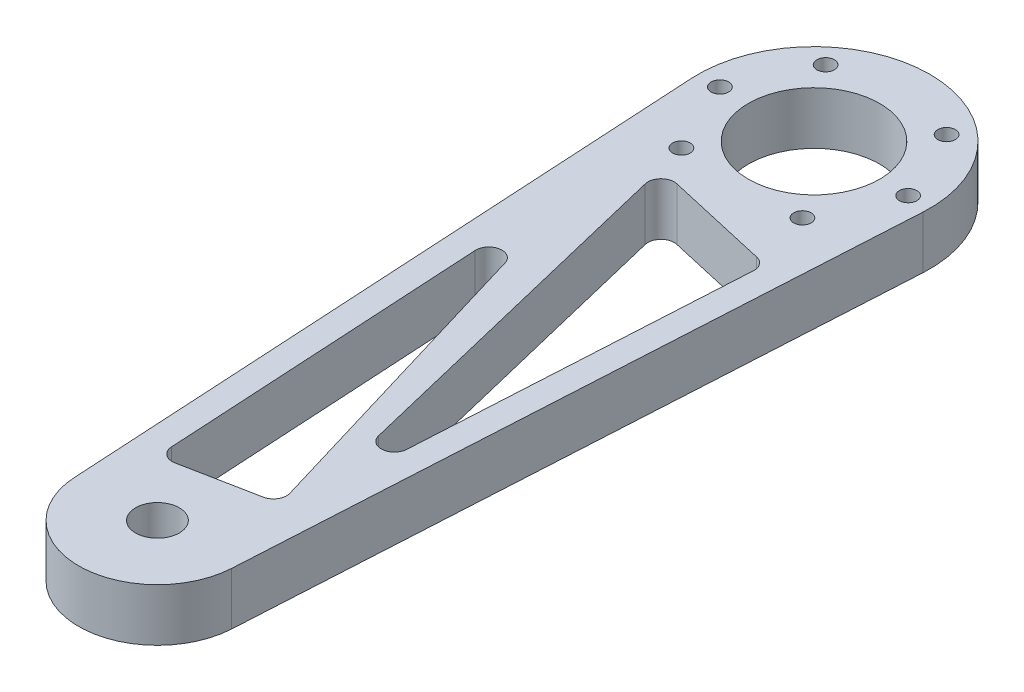
ISO-10303-21;
HEADER;
FILE_DESCRIPTION(('STEP AP214'),'2;1');
FILE_NAME('part.step','',(''),(''),'','','');
FILE_SCHEMA(('AUTOMOTIVE_DESIGN { 1 0 10303 214 1 1 1 1 }'));
ENDSEC;
DATA;
#1=APPLICATION_CONTEXT('core data for automotive mechanical design processes');
#2=APPLICATION_PROTOCOL_DEFINITION('international standard','automotive_design',2000,#1);
#3=PRODUCT_CONTEXT('',#1,'mechanical');
#4=PRODUCT('Part','Part','',(#3));
#5=PRODUCT_RELATED_PRODUCT_CATEGORY('part','',(#4));
#6=PRODUCT_DEFINITION_FORMATION('','',#4);
#7=PRODUCT_DEFINITION_CONTEXT('part definition',#1,'design');
#8=PRODUCT_DEFINITION('design','',#6,#7);
#9=PRODUCT_DEFINITION_SHAPE('','',#8);
#10=(LENGTH_UNIT() NAMED_UNIT(*) SI_UNIT(.MILLI.,.METRE.));
#11=(NAMED_UNIT(*) PLANE_ANGLE_UNIT() SI_UNIT($,.RADIAN.));
#12=(NAMED_UNIT(*) SI_UNIT($,.STERADIAN.) SOLID_ANGLE_UNIT());
#13=UNCERTAINTY_MEASURE_WITH_UNIT(LENGTH_MEASURE(1.E-05),#10,'distance_accuracy_value','');
#14=(GEOMETRIC_REPRESENTATION_CONTEXT(3) GLOBAL_UNCERTAINTY_ASSIGNED_CONTEXT((#13)) GLOBAL_UNIT_ASSIGNED_CONTEXT((#10,
#11,#12)) REPRESENTATION_CONTEXT('',''));
#15=CARTESIAN_POINT('',(0.,0.,0.));
#16=DIRECTION('',(0.,0.,1.));
#17=DIRECTION('',(1.,0.,0.));
#18=AXIS2_PLACEMENT_3D('',#15,#16,#17);
#19=CARTESIAN_POINT('',(0.,12.,0.));
#20=DIRECTION('',(0.,1.,0.));
#21=DIRECTION('',(0.,0.,1.));
#22=AXIS2_PLACEMENT_3D('',#19,#20,#21);
#23=PLANE('',#22);
#24=CARTESIAN_POINT('',(-13.8199336082606,12.,-166.469955527058));
#25=DIRECTION('',(0.,1.,0.));
#26=DIRECTION('',(-0.766044443118979,0.,0.642787609686538));
#27=AXIS2_PLACEMENT_3D('',#24,#25,#26);
#28=CIRCLE('',#27,2.);
#29=CARTESIAN_POINT('',(-15.3520224944985,12.,-165.184380307685));
#30=VERTEX_POINT('',#29);
#31=EDGE_CURVE('E372',#30,#30,#28,.T.);
#32=ORIENTED_EDGE('',*,*,#31,.F.);
#33=EDGE_LOOP('',(#32));
#34=FACE_BOUND('',#33,.T.);
#35=CARTESIAN_POINT('',(13.8199336082606,12.,-133.530044472942));
#36=DIRECTION('',(0.,1.,0.));
#37=DIRECTION('',(-0.766044443118979,0.,0.642787609686538));
#38=AXIS2_PLACEMENT_3D('',#35,#36,#37);
#39=CIRCLE('',#38,2.);
#40=CARTESIAN_POINT('',(12.2878447220226,12.,-132.244469253569));
#41=VERTEX_POINT('',#40);
#42=EDGE_CURVE('E378',#41,#41,#39,.T.);
#43=ORIENTED_EDGE('',*,*,#42,.F.);
#44=EDGE_LOOP('',(#43));
#45=FACE_BOUND('',#44,.T.);
#46=CARTESIAN_POINT('',(-13.8199336082606,12.,-133.530044472942));
#47=DIRECTION('',(0.,1.,0.));
#48=DIRECTION('',(0.766044443118979,0.,0.642787609686538));
#49=AXIS2_PLACEMENT_3D('',#46,#47,#48);
#50=CIRCLE('',#49,2.);
#51=CARTESIAN_POINT('',(-12.2878447220226,12.,-132.244469253569));
#52=VERTEX_POINT('',#51);
#53=EDGE_CURVE('E387',#52,#52,#50,.T.);
#54=ORIENTED_EDGE('',*,*,#53,.F.);
#55=EDGE_LOOP('',(#54));
#56=FACE_BOUND('',#55,.T.);
#57=CARTESIAN_POINT('',(13.8199336082606,12.,-166.469955527058));
#58=DIRECTION('',(0.,1.,0.));
#59=DIRECTION('',(0.766044443118979,0.,0.642787609686538));
#60=AXIS2_PLACEMENT_3D('',#57,#58,#59);
#61=CIRCLE('',#60,2.);
#62=CARTESIAN_POINT('',(15.3520224944985,12.,-165.184380307685));
#63=VERTEX_POINT('',#62);
#64=EDGE_CURVE('E375',#63,#63,#61,.T.);
#65=ORIENTED_EDGE('',*,*,#64,.F.);
#66=EDGE_LOOP('',(#65));
#67=FACE_BOUND('',#66,.T.);
#68=CARTESIAN_POINT('',(-21.5,12.,-150.));
#69=DIRECTION('',(0.,1.,0.));
#70=DIRECTION('',(0.,0.,1.));
#71=AXIS2_PLACEMENT_3D('',#68,#69,#70);
#72=CIRCLE('',#71,2.);
#73=CARTESIAN_POINT('',(-21.5,12.,-148.));
#74=VERTEX_POINT('',#73);
#75=EDGE_CURVE('E399',#74,#74,#72,.T.);
#76=ORIENTED_EDGE('',*,*,#75,.F.);
#77=EDGE_LOOP('',(#76));
#78=FACE_BOUND('',#77,.T.);
#79=CARTESIAN_POINT('',(21.5,12.,-150.));
#80=DIRECTION('',(0.,1.,0.));
#81=DIRECTION('',(0.,0.,1.));
#82=AXIS2_PLACEMENT_3D('',#79,#80,#81);
#83=CIRCLE('',#82,2.);
#84=CARTESIAN_POINT('',(21.5,12.,-148.));
#85=VERTEX_POINT('',#84);
#86=EDGE_CURVE('E386',#85,#85,#83,.T.);
#87=ORIENTED_EDGE('',*,*,#86,.F.);
#88=EDGE_LOOP('',(#87));
#89=FACE_BOUND('',#88,.T.);
#90=CARTESIAN_POINT('',(0.,12.,0.));
#91=DIRECTION('',(0.,1.,0.));
#92=DIRECTION('',(0.,0.,1.));
#93=AXIS2_PLACEMENT_3D('',#90,#91,#92);
#94=CIRCLE('',#93,5.);
#95=CARTESIAN_POINT('',(0.,12.,5.));
#96=VERTEX_POINT('',#95);
#97=EDGE_CURVE('E271',#96,#96,#94,.T.);
#98=ORIENTED_EDGE('',*,*,#97,.F.);
#99=EDGE_LOOP('',(#98));
#100=FACE_BOUND('',#99,.T.);
#101=CARTESIAN_POINT('',(0.,12.,0.));
#102=DIRECTION('',(0.,1.,0.));
#103=DIRECTION('',(0.,0.,1.));
#104=AXIS2_PLACEMENT_3D('',#101,#102,#103);
#105=CIRCLE('',#104,18.);
#106=CARTESIAN_POINT('',(-17.971076762398,12.,1.02));
#107=VERTEX_POINT('',#106);
#108=CARTESIAN_POINT('',(17.971076762398,12.,1.02));
#109=VERTEX_POINT('',#108);
#110=EDGE_CURVE('E163',#107,#109,#105,.T.);
#111=ORIENTED_EDGE('',*,*,#110,.T.);
#112=DIRECTION('',(0.0566666666666667,0.,-0.998393153466553));
#113=VECTOR('',#112,1.);
#114=CARTESIAN_POINT('',(17.971076762398,12.,1.02));
#115=LINE('',#114,#113);
#116=CARTESIAN_POINT('',(26.4574185668637,12.,-148.498333333333));
#117=VERTEX_POINT('',#116);
#118=EDGE_CURVE('E152',#109,#117,#115,.T.);
#119=ORIENTED_EDGE('',*,*,#118,.T.);
#120=CARTESIAN_POINT('',(0.,12.,-150.));
#121=DIRECTION('',(0.,1.,0.));
#122=DIRECTION('',(0.,0.,-1.));
#123=AXIS2_PLACEMENT_3D('',#120,#121,#122);
#124=CIRCLE('',#123,26.5);
#125=CARTESIAN_POINT('',(-26.4574185668637,12.,-148.498333333333));
#126=VERTEX_POINT('',#125);
#127=EDGE_CURVE('E162',#117,#126,#124,.T.);
#128=ORIENTED_EDGE('',*,*,#127,.T.);
#129=DIRECTION('',(0.0566666666666667,0.,0.998393153466553));
#130=VECTOR('',#129,1.);
#131=CARTESIAN_POINT('',(-17.971076762398,12.,1.02));
#132=LINE('',#131,#130);
#133=EDGE_CURVE('E168',#126,#107,#132,.T.);
#134=ORIENTED_EDGE('',*,*,#133,.T.);
#135=EDGE_LOOP('',(#111,#119,#128,#134));
#136=FACE_BOUND('',#135,.T.);
#137=CARTESIAN_POINT('',(0.,12.,-150.));
#138=DIRECTION('',(0.,1.,0.));
#139=DIRECTION('',(0.,0.,1.));
#140=AXIS2_PLACEMENT_3D('',#137,#138,#139);
#141=CIRCLE('',#140,15.);
#142=CARTESIAN_POINT('',(0.,12.,-135.));
#143=VERTEX_POINT('',#142);
#144=EDGE_CURVE('E265',#143,#143,#141,.T.);
#145=ORIENTED_EDGE('',*,*,#144,.F.);
#146=EDGE_LOOP('',(#145));
#147=FACE_BOUND('',#146,.T.);
#148=DIRECTION('',(-0.286666756449605,0.,-0.958030360033889));
#149=VECTOR('',#148,1.);
#150=CARTESIAN_POINT('',(-18.5543851913669,12.,-115.139490738387));
#151=LINE('',#150,#149);
#152=CARTESIAN_POINT('',(9.76560528215196,12.,-20.4950645568282));
#153=VERTEX_POINT('',#152);
#154=CARTESIAN_POINT('',(-11.2390630531947,12.,-90.6919378076061));
#155=VERTEX_POINT('',#154);
#156=EDGE_CURVE('E251',#153,#155,#151,.T.);
#157=ORIENTED_EDGE('',*,*,#156,.F.);
#158=CARTESIAN_POINT('',(6.8915142020503,12.,-19.6350642874794));
#159=DIRECTION('',(0.,1.,0.));
#160=DIRECTION('',(0.,0.,1.));
#161=AXIS2_PLACEMENT_3D('',#158,#159,#160);
#162=CIRCLE('',#161,3.);
#163=CARTESIAN_POINT('',(7.47066200637673,12.,-16.6914970943031));
#164=VERTEX_POINT('',#163);
#165=EDGE_CURVE('E11',#153,#164,#162,.F.);
#166=ORIENTED_EDGE('',*,*,#165,.T.);
#167=DIRECTION('',(0.981189064392104,0.,-0.19304926810881));
#168=VECTOR('',#167,1.);
#169=CARTESIAN_POINT('',(10.7128519545465,12.,-17.3293990229714));
#170=LINE('',#169,#168);
#171=CARTESIAN_POINT('',(-9.3618110753663,12.,-13.3797025311371));
#172=VERTEX_POINT('',#171);
#173=EDGE_CURVE('E249',#172,#164,#170,.T.);
#174=ORIENTED_EDGE('',*,*,#173,.F.);
#175=CARTESIAN_POINT('',(-9.94095887969273,12.,-16.3232697243134));
#176=DIRECTION('',(0.,1.,0.));
#177=DIRECTION('',(0.,0.,1.));
#178=AXIS2_PLACEMENT_3D('',#175,#176,#177);
#179=CIRCLE('',#178,3.);
#180=CARTESIAN_POINT('',(-12.9361383400924,12.,-16.1532697243134));
#181=VERTEX_POINT('',#180);
#182=EDGE_CURVE('E225',#172,#181,#179,.F.);
#183=ORIENTED_EDGE('',*,*,#182,.T.);
#184=DIRECTION('',(0.0566666666666666,0.,0.998393153466553));
#185=VECTOR('',#184,1.);
#186=CARTESIAN_POINT('',(-12.7409809539486,12.,-12.7148497565296));
#187=LINE('',#186,#185);
#188=CARTESIAN_POINT('',(-17.108333593696,12.,-89.6619375382572));
#189=VERTEX_POINT('',#188);
#190=EDGE_CURVE('E253',#189,#181,#187,.T.);
#191=ORIENTED_EDGE('',*,*,#190,.F.);
#192=CARTESIAN_POINT('',(-14.1131541332963,12.,-89.8319375382572));
#193=DIRECTION('',(0.,1.,0.));
#194=DIRECTION('',(0.,0.,1.));
#195=AXIS2_PLACEMENT_3D('',#192,#193,#194);
#196=CIRCLE('',#195,3.);
#197=EDGE_CURVE('E221',#189,#155,#196,.F.);
#198=ORIENTED_EDGE('',*,*,#197,.T.);
#199=EDGE_LOOP('',(#157,#166,#174,#183,#191,#198));
#200=FACE_BOUND('',#199,.T.);
#201=DIRECTION('',(0.234668209936248,0.,0.972075527541619));
#202=VECTOR('',#201,1.);
#203=CARTESIAN_POINT('',(-12.,12.,-127.));
#204=LINE('',#203,#202);
#205=CARTESIAN_POINT('',(-10.8653488920019,12.,-122.299889257763));
#206=VERTEX_POINT('',#205);
#207=CARTESIAN_POINT('',(8.52161939319862,12.,-41.992473829023));
#208=VERTEX_POINT('',#207);
#209=EDGE_CURVE('E410',#206,#208,#204,.T.);
#210=ORIENTED_EDGE('',*,*,#209,.F.);
#211=CARTESIAN_POINT('',(-7.94912230937701,12.,-123.003893887571));
#212=DIRECTION('',(0.,1.,0.));
#213=DIRECTION('',(0.,0.,1.));
#214=AXIS2_PLACEMENT_3D('',#211,#212,#213);
#215=CIRCLE('',#214,3.);
#216=CARTESIAN_POINT('',(-7.28487950298156,12.,-125.929433409463));
#217=VERTEX_POINT('',#216);
#218=EDGE_CURVE('E217',#206,#217,#215,.F.);
#219=ORIENTED_EDGE('',*,*,#218,.T.);
#220=DIRECTION('',(-0.975179840630658,0.,-0.221414268798477));
#221=VECTOR('',#220,1.);
#222=CARTESIAN_POINT('',(18.8302573337206,12.,-120.));
#223=LINE('',#222,#221);
#224=CARTESIAN_POINT('',(16.3555160897141,12.,-120.561889202563));
#225=VERTEX_POINT('',#224);
#226=EDGE_CURVE('E407',#225,#217,#223,.T.);
#227=ORIENTED_EDGE('',*,*,#226,.F.);
#228=CARTESIAN_POINT('',(15.6912732833187,12.,-117.636349680671));
#229=DIRECTION('',(0.,1.,0.));
#230=DIRECTION('',(0.,0.,1.));
#231=AXIS2_PLACEMENT_3D('',#228,#229,#230);
#232=CIRCLE('',#231,3.);
#233=CARTESIAN_POINT('',(18.6864527437183,12.,-117.466349680671));
#234=VERTEX_POINT('',#233);
#235=EDGE_CURVE('E213',#225,#234,#232,.F.);
#236=ORIENTED_EDGE('',*,*,#235,.T.);
#237=DIRECTION('',(0.0566666666666667,0.,-0.998393153466553));
#238=VECTOR('',#237,1.);
#239=CARTESIAN_POINT('',(13.2832157063432,12.,-22.2683226570439));
#240=LINE('',#239,#238);
#241=CARTESIAN_POINT('',(14.4330254362231,12.,-42.5264784588318));
#242=VERTEX_POINT('',#241);
#243=EDGE_CURVE('E263',#242,#234,#240,.T.);
#244=ORIENTED_EDGE('',*,*,#243,.F.);
#245=CARTESIAN_POINT('',(11.4378459758235,12.,-42.6964784588318));
#246=DIRECTION('',(0.,1.,0.));
#247=DIRECTION('',(0.,0.,1.));
#248=AXIS2_PLACEMENT_3D('',#245,#246,#247);
#249=CIRCLE('',#248,3.);
#250=EDGE_CURVE('E229',#242,#208,#249,.F.);
#251=ORIENTED_EDGE('',*,*,#250,.T.);
#252=EDGE_LOOP('',(#210,#219,#227,#236,#244,#251));
#253=FACE_BOUND('',#252,.T.);
#254=ADVANCED_FACE('F39',(#34,#45,#56,#67,#78,#89,#100,#136,#147,#200,#253),#23,.T.);
#255=CARTESIAN_POINT('',(0.,0.,0.));
#256=DIRECTION('',(0.,1.,0.));
#257=DIRECTION('',(0.,0.,1.));
#258=AXIS2_PLACEMENT_3D('',#255,#256,#257);
#259=PLANE('',#258);
#260=CARTESIAN_POINT('',(-13.8199336082606,0.,-166.469955527058));
#261=DIRECTION('',(0.,1.,0.));
#262=DIRECTION('',(-0.766044443118979,0.,0.642787609686538));
#263=AXIS2_PLACEMENT_3D('',#260,#261,#262);
#264=CIRCLE('',#263,2.);
#265=CARTESIAN_POINT('',(-15.3520224944985,0.,-165.184380307685));
#266=VERTEX_POINT('',#265);
#267=EDGE_CURVE('E370',#266,#266,#264,.T.);
#268=ORIENTED_EDGE('',*,*,#267,.T.);
#269=EDGE_LOOP('',(#268));
#270=FACE_BOUND('',#269,.T.);
#271=CARTESIAN_POINT('',(13.8199336082606,0.,-133.530044472942));
#272=DIRECTION('',(0.,1.,0.));
#273=DIRECTION('',(-0.766044443118979,0.,0.642787609686538));
#274=AXIS2_PLACEMENT_3D('',#271,#272,#273);
#275=CIRCLE('',#274,2.);
#276=CARTESIAN_POINT('',(12.2878447220226,0.,-132.244469253569));
#277=VERTEX_POINT('',#276);
#278=EDGE_CURVE('E373',#277,#277,#275,.T.);
#279=ORIENTED_EDGE('',*,*,#278,.T.);
#280=EDGE_LOOP('',(#279));
#281=FACE_BOUND('',#280,.T.);
#282=CARTESIAN_POINT('',(-13.8199336082606,0.,-133.530044472942));
#283=DIRECTION('',(0.,1.,0.));
#284=DIRECTION('',(0.766044443118979,0.,0.642787609686538));
#285=AXIS2_PLACEMENT_3D('',#282,#283,#284);
#286=CIRCLE('',#285,2.);
#287=CARTESIAN_POINT('',(-12.2878447220226,0.,-132.244469253569));
#288=VERTEX_POINT('',#287);
#289=EDGE_CURVE('E383',#288,#288,#286,.T.);
#290=ORIENTED_EDGE('',*,*,#289,.T.);
#291=EDGE_LOOP('',(#290));
#292=FACE_BOUND('',#291,.T.);
#293=CARTESIAN_POINT('',(13.8199336082606,0.,-166.469955527058));
#294=DIRECTION('',(0.,1.,0.));
#295=DIRECTION('',(0.766044443118979,0.,0.642787609686538));
#296=AXIS2_PLACEMENT_3D('',#293,#294,#295);
#297=CIRCLE('',#296,2.);
#298=CARTESIAN_POINT('',(15.3520224944985,0.,-165.184380307685));
#299=VERTEX_POINT('',#298);
#300=EDGE_CURVE('E390',#299,#299,#297,.T.);
#301=ORIENTED_EDGE('',*,*,#300,.T.);
#302=EDGE_LOOP('',(#301));
#303=FACE_BOUND('',#302,.T.);
#304=CARTESIAN_POINT('',(-21.5,0.,-150.));
#305=DIRECTION('',(0.,1.,0.));
#306=DIRECTION('',(0.,0.,1.));
#307=AXIS2_PLACEMENT_3D('',#304,#305,#306);
#308=CIRCLE('',#307,2.);
#309=CARTESIAN_POINT('',(-21.5,0.,-148.));
#310=VERTEX_POINT('',#309);
#311=EDGE_CURVE('E395',#310,#310,#308,.T.);
#312=ORIENTED_EDGE('',*,*,#311,.T.);
#313=EDGE_LOOP('',(#312));
#314=FACE_BOUND('',#313,.T.);
#315=CARTESIAN_POINT('',(21.5,0.,-150.));
#316=DIRECTION('',(0.,1.,0.));
#317=DIRECTION('',(0.,0.,1.));
#318=AXIS2_PLACEMENT_3D('',#315,#316,#317);
#319=CIRCLE('',#318,2.);
#320=CARTESIAN_POINT('',(21.5,0.,-148.));
#321=VERTEX_POINT('',#320);
#322=EDGE_CURVE('E402',#321,#321,#319,.T.);
#323=ORIENTED_EDGE('',*,*,#322,.T.);
#324=EDGE_LOOP('',(#323));
#325=FACE_BOUND('',#324,.T.);
#326=DIRECTION('',(0.0566666666666666,0.,0.998393153466553));
#327=VECTOR('',#326,1.);
#328=CARTESIAN_POINT('',(-12.7409809539486,0.,-12.7148497565296));
#329=LINE('',#328,#327);
#330=CARTESIAN_POINT('',(-17.108333593696,0.,-89.6619375382572));
#331=VERTEX_POINT('',#330);
#332=CARTESIAN_POINT('',(-12.9361383400924,0.,-16.1532697243134));
#333=VERTEX_POINT('',#332);
#334=EDGE_CURVE('E246',#331,#333,#329,.T.);
#335=ORIENTED_EDGE('',*,*,#334,.T.);
#336=CARTESIAN_POINT('',(-9.94095887969273,0.,-16.3232697243134));
#337=DIRECTION('',(0.,1.,0.));
#338=DIRECTION('',(0.,0.,1.));
#339=AXIS2_PLACEMENT_3D('',#336,#337,#338);
#340=CIRCLE('',#339,3.);
#341=CARTESIAN_POINT('',(-9.3618110753663,0.,-13.3797025311371));
#342=VERTEX_POINT('',#341);
#343=EDGE_CURVE('E223',#333,#342,#340,.T.);
#344=ORIENTED_EDGE('',*,*,#343,.T.);
#345=DIRECTION('',(0.981189064392104,0.,-0.19304926810881));
#346=VECTOR('',#345,1.);
#347=CARTESIAN_POINT('',(10.7128519545465,0.,-17.3293990229714));
#348=LINE('',#347,#346);
#349=CARTESIAN_POINT('',(7.47066200637673,0.,-16.6914970943031));
#350=VERTEX_POINT('',#349);
#351=EDGE_CURVE('E238',#342,#350,#348,.T.);
#352=ORIENTED_EDGE('',*,*,#351,.T.);
#353=CARTESIAN_POINT('',(6.8915142020503,0.,-19.6350642874794));
#354=DIRECTION('',(0.,1.,0.));
#355=DIRECTION('',(0.,0.,1.));
#356=AXIS2_PLACEMENT_3D('',#353,#354,#355);
#357=CIRCLE('',#356,3.);
#358=CARTESIAN_POINT('',(9.76560528215196,0.,-20.4950645568282));
#359=VERTEX_POINT('',#358);
#360=EDGE_CURVE('E47',#350,#359,#357,.T.);
#361=ORIENTED_EDGE('',*,*,#360,.T.);
#362=DIRECTION('',(-0.286666756449605,0.,-0.958030360033889));
#363=VECTOR('',#362,1.);
#364=CARTESIAN_POINT('',(-18.5543851913669,0.,-115.139490738387));
#365=LINE('',#364,#363);
#366=CARTESIAN_POINT('',(-11.2390630531947,0.,-90.6919378076061));
#367=VERTEX_POINT('',#366);
#368=EDGE_CURVE('E237',#359,#367,#365,.T.);
#369=ORIENTED_EDGE('',*,*,#368,.T.);
#370=CARTESIAN_POINT('',(-14.1131541332963,0.,-89.8319375382572));
#371=DIRECTION('',(0.,1.,0.));
#372=DIRECTION('',(0.,0.,1.));
#373=AXIS2_PLACEMENT_3D('',#370,#371,#372);
#374=CIRCLE('',#373,3.);
#375=EDGE_CURVE('E219',#367,#331,#374,.T.);
#376=ORIENTED_EDGE('',*,*,#375,.T.);
#377=EDGE_LOOP('',(#335,#344,#352,#361,#369,#376));
#378=FACE_BOUND('',#377,.T.);
#379=CARTESIAN_POINT('',(0.,0.,0.));
#380=DIRECTION('',(0.,1.,0.));
#381=DIRECTION('',(0.,0.,1.));
#382=AXIS2_PLACEMENT_3D('',#379,#380,#381);
#383=CIRCLE('',#382,18.);
#384=CARTESIAN_POINT('',(-17.971076762398,0.,1.02));
#385=VERTEX_POINT('',#384);
#386=CARTESIAN_POINT('',(17.971076762398,0.,1.02));
#387=VERTEX_POINT('',#386);
#388=EDGE_CURVE('E176',#385,#387,#383,.T.);
#389=ORIENTED_EDGE('',*,*,#388,.F.);
#390=DIRECTION('',(0.0566666666666667,0.,0.998393153466553));
#391=VECTOR('',#390,1.);
#392=CARTESIAN_POINT('',(-17.971076762398,0.,1.02));
#393=LINE('',#392,#391);
#394=CARTESIAN_POINT('',(-26.4574185668637,0.,-148.498333333333));
#395=VERTEX_POINT('',#394);
#396=EDGE_CURVE('E172',#395,#385,#393,.T.);
#397=ORIENTED_EDGE('',*,*,#396,.F.);
#398=CARTESIAN_POINT('',(0.,0.,-150.));
#399=DIRECTION('',(0.,1.,0.));
#400=DIRECTION('',(0.,0.,-1.));
#401=AXIS2_PLACEMENT_3D('',#398,#399,#400);
#402=CIRCLE('',#401,26.5);
#403=CARTESIAN_POINT('',(26.4574185668637,0.,-148.498333333333));
#404=VERTEX_POINT('',#403);
#405=EDGE_CURVE('E282',#404,#395,#402,.T.);
#406=ORIENTED_EDGE('',*,*,#405,.F.);
#407=DIRECTION('',(0.0566666666666667,0.,-0.998393153466553));
#408=VECTOR('',#407,1.);
#409=CARTESIAN_POINT('',(17.971076762398,0.,1.02));
#410=LINE('',#409,#408);
#411=EDGE_CURVE('E280',#387,#404,#410,.T.);
#412=ORIENTED_EDGE('',*,*,#411,.F.);
#413=EDGE_LOOP('',(#389,#397,#406,#412));
#414=FACE_BOUND('',#413,.T.);
#415=CARTESIAN_POINT('',(0.,0.,0.));
#416=DIRECTION('',(0.,1.,0.));
#417=DIRECTION('',(0.,0.,1.));
#418=AXIS2_PLACEMENT_3D('',#415,#416,#417);
#419=CIRCLE('',#418,5.);
#420=CARTESIAN_POINT('',(0.,0.,5.));
#421=VERTEX_POINT('',#420);
#422=EDGE_CURVE('E268',#421,#421,#419,.T.);
#423=ORIENTED_EDGE('',*,*,#422,.T.);
#424=EDGE_LOOP('',(#423));
#425=FACE_BOUND('',#424,.T.);
#426=CARTESIAN_POINT('',(0.,0.,-150.));
#427=DIRECTION('',(0.,1.,0.));
#428=DIRECTION('',(0.,0.,1.));
#429=AXIS2_PLACEMENT_3D('',#426,#427,#428);
#430=CIRCLE('',#429,15.);
#431=CARTESIAN_POINT('',(0.,0.,-135.));
#432=VERTEX_POINT('',#431);
#433=EDGE_CURVE('E262',#432,#432,#430,.T.);
#434=ORIENTED_EDGE('',*,*,#433,.T.);
#435=EDGE_LOOP('',(#434));
#436=FACE_BOUND('',#435,.T.);
#437=DIRECTION('',(0.0566666666666667,0.,-0.998393153466553));
#438=VECTOR('',#437,1.);
#439=CARTESIAN_POINT('',(13.2832157063432,0.,-22.2683226570439));
#440=LINE('',#439,#438);
#441=CARTESIAN_POINT('',(14.4330254362231,0.,-42.5264784588318));
#442=VERTEX_POINT('',#441);
#443=CARTESIAN_POINT('',(18.6864527437183,0.,-117.466349680671));
#444=VERTEX_POINT('',#443);
#445=EDGE_CURVE('E257',#442,#444,#440,.T.);
#446=ORIENTED_EDGE('',*,*,#445,.T.);
#447=CARTESIAN_POINT('',(15.6912732833187,0.,-117.636349680671));
#448=DIRECTION('',(0.,1.,0.));
#449=DIRECTION('',(0.,0.,1.));
#450=AXIS2_PLACEMENT_3D('',#447,#448,#449);
#451=CIRCLE('',#450,3.);
#452=CARTESIAN_POINT('',(16.3555160897141,0.,-120.561889202563));
#453=VERTEX_POINT('',#452);
#454=EDGE_CURVE('E211',#444,#453,#451,.T.);
#455=ORIENTED_EDGE('',*,*,#454,.T.);
#456=DIRECTION('',(-0.975179840630658,0.,-0.221414268798477));
#457=VECTOR('',#456,1.);
#458=CARTESIAN_POINT('',(18.8302573337206,0.,-120.));
#459=LINE('',#458,#457);
#460=CARTESIAN_POINT('',(-7.28487950298156,0.,-125.929433409463));
#461=VERTEX_POINT('',#460);
#462=EDGE_CURVE('E398',#453,#461,#459,.T.);
#463=ORIENTED_EDGE('',*,*,#462,.T.);
#464=CARTESIAN_POINT('',(-7.94912230937701,0.,-123.003893887571));
#465=DIRECTION('',(0.,1.,0.));
#466=DIRECTION('',(0.,0.,1.));
#467=AXIS2_PLACEMENT_3D('',#464,#465,#466);
#468=CIRCLE('',#467,3.);
#469=CARTESIAN_POINT('',(-10.8653488920019,0.,-122.299889257763));
#470=VERTEX_POINT('',#469);
#471=EDGE_CURVE('E215',#461,#470,#468,.T.);
#472=ORIENTED_EDGE('',*,*,#471,.T.);
#473=DIRECTION('',(0.234668209936248,0.,0.972075527541619));
#474=VECTOR('',#473,1.);
#475=CARTESIAN_POINT('',(-12.,0.,-127.));
#476=LINE('',#475,#474);
#477=CARTESIAN_POINT('',(8.52161939319862,0.,-41.992473829023));
#478=VERTEX_POINT('',#477);
#479=EDGE_CURVE('E416',#470,#478,#476,.T.);
#480=ORIENTED_EDGE('',*,*,#479,.T.);
#481=CARTESIAN_POINT('',(11.4378459758235,0.,-42.6964784588318));
#482=DIRECTION('',(0.,1.,0.));
#483=DIRECTION('',(0.,0.,1.));
#484=AXIS2_PLACEMENT_3D('',#481,#482,#483);
#485=CIRCLE('',#484,3.);
#486=EDGE_CURVE('E227',#478,#442,#485,.T.);
#487=ORIENTED_EDGE('',*,*,#486,.T.);
#488=EDGE_LOOP('',(#446,#455,#463,#472,#480,#487));
#489=FACE_BOUND('',#488,.T.);
#490=ADVANCED_FACE('F235',(#270,#281,#292,#303,#314,#325,#378,#414,#425,#436,#489),#259,.F.);
#491=CARTESIAN_POINT('',(0.,12.,0.));
#492=DIRECTION('',(0.,-1.,0.));
#493=DIRECTION('',(0.,0.,-1.));
#494=AXIS2_PLACEMENT_3D('',#491,#492,#493);
#495=CYLINDRICAL_SURFACE('',#494,18.);
#496=ORIENTED_EDGE('',*,*,#388,.T.);
#497=DIRECTION('',(0.,-1.,0.));
#498=VECTOR('',#497,1.);
#499=CARTESIAN_POINT('',(17.971076762398,12.,1.02));
#500=LINE('',#499,#498);
#501=EDGE_CURVE('E156',#109,#387,#500,.T.);
#502=ORIENTED_EDGE('',*,*,#501,.F.);
#503=ORIENTED_EDGE('',*,*,#110,.F.);
#504=DIRECTION('',(0.,-1.,0.));
#505=VECTOR('',#504,1.);
#506=CARTESIAN_POINT('',(-17.971076762398,12.,1.02));
#507=LINE('',#506,#505);
#508=EDGE_CURVE('E278',#107,#385,#507,.T.);
#509=ORIENTED_EDGE('',*,*,#508,.T.);
#510=EDGE_LOOP('',(#496,#502,#503,#509));
#511=FACE_BOUND('',#510,.T.);
#512=ADVANCED_FACE('F174',(#511),#495,.T.);
#513=CARTESIAN_POINT('',(17.971076762398,12.,1.02));
#514=DIRECTION('',(-0.998393153466553,0.,-0.0566666666666667));
#515=DIRECTION('',(-0.0566666666666667,0.,0.998393153466553));
#516=AXIS2_PLACEMENT_3D('',#513,#514,#515);
#517=PLANE('',#516);
#518=ORIENTED_EDGE('',*,*,#411,.T.);
#519=DIRECTION('',(0.,-1.,0.));
#520=VECTOR('',#519,1.);
#521=CARTESIAN_POINT('',(26.4574185668637,12.,-148.498333333333));
#522=LINE('',#521,#520);
#523=EDGE_CURVE('E159',#117,#404,#522,.T.);
#524=ORIENTED_EDGE('',*,*,#523,.F.);
#525=ORIENTED_EDGE('',*,*,#118,.F.);
#526=ORIENTED_EDGE('',*,*,#501,.T.);
#527=EDGE_LOOP('',(#518,#524,#525,#526));
#528=FACE_BOUND('',#527,.T.);
#529=ADVANCED_FACE('F154',(#528),#517,.F.);
#530=CARTESIAN_POINT('',(0.,12.,-150.));
#531=DIRECTION('',(0.,-1.,0.));
#532=DIRECTION('',(0.,0.,-1.));
#533=AXIS2_PLACEMENT_3D('',#530,#531,#532);
#534=CYLINDRICAL_SURFACE('',#533,26.5);
#535=ORIENTED_EDGE('',*,*,#405,.T.);
#536=DIRECTION('',(0.,-1.,0.));
#537=VECTOR('',#536,1.);
#538=CARTESIAN_POINT('',(-26.4574185668637,12.,-148.498333333333));
#539=LINE('',#538,#537);
#540=EDGE_CURVE('E181',#126,#395,#539,.T.);
#541=ORIENTED_EDGE('',*,*,#540,.F.);
#542=ORIENTED_EDGE('',*,*,#127,.F.);
#543=ORIENTED_EDGE('',*,*,#523,.T.);
#544=EDGE_LOOP('',(#535,#541,#542,#543));
#545=FACE_BOUND('',#544,.T.);
#546=ADVANCED_FACE('F293',(#545),#534,.T.);
#547=CARTESIAN_POINT('',(-17.971076762398,12.,1.02));
#548=DIRECTION('',(0.998393153466553,0.,-0.0566666666666667));
#549=DIRECTION('',(-0.0566666666666667,0.,-0.998393153466553));
#550=AXIS2_PLACEMENT_3D('',#547,#548,#549);
#551=PLANE('',#550);
#552=ORIENTED_EDGE('',*,*,#396,.T.);
#553=ORIENTED_EDGE('',*,*,#508,.F.);
#554=ORIENTED_EDGE('',*,*,#133,.F.);
#555=ORIENTED_EDGE('',*,*,#540,.T.);
#556=EDGE_LOOP('',(#552,#553,#554,#555));
#557=FACE_BOUND('',#556,.T.);
#558=ADVANCED_FACE('F289',(#557),#551,.F.);
#559=CARTESIAN_POINT('',(0.,12.,0.));
#560=DIRECTION('',(0.,-1.,0.));
#561=DIRECTION('',(0.,0.,-1.));
#562=AXIS2_PLACEMENT_3D('',#559,#560,#561);
#563=CYLINDRICAL_SURFACE('',#562,5.);
#564=ORIENTED_EDGE('',*,*,#97,.T.);
#565=EDGE_LOOP('',(#564));
#566=FACE_BOUND('',#565,.T.);
#567=ORIENTED_EDGE('',*,*,#422,.F.);
#568=EDGE_LOOP('',(#567));
#569=FACE_BOUND('',#568,.T.);
#570=ADVANCED_FACE('F300',(#566,#569),#563,.F.);
#571=CARTESIAN_POINT('',(0.,12.,-150.));
#572=DIRECTION('',(0.,-1.,0.));
#573=DIRECTION('',(0.,0.,-1.));
#574=AXIS2_PLACEMENT_3D('',#571,#572,#573);
#575=CYLINDRICAL_SURFACE('',#574,15.);
#576=ORIENTED_EDGE('',*,*,#144,.T.);
#577=EDGE_LOOP('',(#576));
#578=FACE_BOUND('',#577,.T.);
#579=ORIENTED_EDGE('',*,*,#433,.F.);
#580=EDGE_LOOP('',(#579));
#581=FACE_BOUND('',#580,.T.);
#582=ADVANCED_FACE('F316',(#578,#581),#575,.F.);
#583=CARTESIAN_POINT('',(10.7128519545465,12.,-17.3293990229714));
#584=DIRECTION('',(-0.19304926810881,0.,-0.981189064392104));
#585=DIRECTION('',(-0.981189064392104,0.,0.19304926810881));
#586=AXIS2_PLACEMENT_3D('',#583,#584,#585);
#587=PLANE('',#586);
#588=ORIENTED_EDGE('',*,*,#351,.F.);
#589=DIRECTION('',(0.,-1.,0.));
#590=VECTOR('',#589,1.);
#591=CARTESIAN_POINT('',(-9.3618110753663,12.,-13.3797025311371));
#592=LINE('',#591,#590);
#593=EDGE_CURVE('E59',#342,#172,#592,.F.);
#594=ORIENTED_EDGE('',*,*,#593,.T.);
#595=ORIENTED_EDGE('',*,*,#173,.T.);
#596=DIRECTION('',(0.,-1.,0.));
#597=VECTOR('',#596,1.);
#598=CARTESIAN_POINT('',(7.47066200637673,0.,-16.6914970943031));
#599=LINE('',#598,#597);
#600=EDGE_CURVE('E207',#164,#350,#599,.T.);
#601=ORIENTED_EDGE('',*,*,#600,.T.);
#602=EDGE_LOOP('',(#588,#594,#595,#601));
#603=FACE_BOUND('',#602,.T.);
#604=ADVANCED_FACE('F248',(#603),#587,.T.);
#605=CARTESIAN_POINT('',(-18.5543851913669,12.,-115.139490738387));
#606=DIRECTION('',(-0.958030360033889,0.,0.286666756449605));
#607=DIRECTION('',(0.286666756449605,0.,0.958030360033889));
#608=AXIS2_PLACEMENT_3D('',#605,#606,#607);
#609=PLANE('',#608);
#610=ORIENTED_EDGE('',*,*,#156,.T.);
#611=DIRECTION('',(0.,-1.,0.));
#612=VECTOR('',#611,1.);
#613=CARTESIAN_POINT('',(-11.2390630531947,0.,-90.6919378076061));
#614=LINE('',#613,#612);
#615=EDGE_CURVE('E199',#155,#367,#614,.T.);
#616=ORIENTED_EDGE('',*,*,#615,.T.);
#617=ORIENTED_EDGE('',*,*,#368,.F.);
#618=DIRECTION('',(0.,-1.,0.));
#619=VECTOR('',#618,1.);
#620=CARTESIAN_POINT('',(9.76560528215196,12.,-20.4950645568282));
#621=LINE('',#620,#619);
#622=EDGE_CURVE('E197',#359,#153,#621,.F.);
#623=ORIENTED_EDGE('',*,*,#622,.T.);
#624=EDGE_LOOP('',(#610,#616,#617,#623));
#625=FACE_BOUND('',#624,.T.);
#626=ADVANCED_FACE('F244',(#625),#609,.T.);
#627=CARTESIAN_POINT('',(-12.7409809539486,12.,-12.7148497565296));
#628=DIRECTION('',(0.998393153466553,0.,-0.0566666666666666));
#629=DIRECTION('',(-0.0566666666666666,0.,-0.998393153466553));
#630=AXIS2_PLACEMENT_3D('',#627,#628,#629);
#631=PLANE('',#630);
#632=ORIENTED_EDGE('',*,*,#334,.F.);
#633=DIRECTION('',(0.,-1.,0.));
#634=VECTOR('',#633,1.);
#635=CARTESIAN_POINT('',(-17.108333593696,12.,-89.6619375382572));
#636=LINE('',#635,#634);
#637=EDGE_CURVE('E205',#331,#189,#636,.F.);
#638=ORIENTED_EDGE('',*,*,#637,.T.);
#639=ORIENTED_EDGE('',*,*,#190,.T.);
#640=DIRECTION('',(0.,-1.,0.));
#641=VECTOR('',#640,1.);
#642=CARTESIAN_POINT('',(-12.9361383400924,0.,-16.1532697243134));
#643=LINE('',#642,#641);
#644=EDGE_CURVE('E202',#181,#333,#643,.T.);
#645=ORIENTED_EDGE('',*,*,#644,.T.);
#646=EDGE_LOOP('',(#632,#638,#639,#645));
#647=FACE_BOUND('',#646,.T.);
#648=ADVANCED_FACE('F325',(#647),#631,.T.);
#649=CARTESIAN_POINT('',(18.8302573337206,12.,-120.));
#650=DIRECTION('',(-0.221414268798477,0.,0.975179840630658));
#651=DIRECTION('',(0.975179840630658,0.,0.221414268798477));
#652=AXIS2_PLACEMENT_3D('',#649,#650,#651);
#653=PLANE('',#652);
#654=ORIENTED_EDGE('',*,*,#462,.F.);
#655=DIRECTION('',(0.,-1.,0.));
#656=VECTOR('',#655,1.);
#657=CARTESIAN_POINT('',(16.3555160897141,12.,-120.561889202563));
#658=LINE('',#657,#656);
#659=EDGE_CURVE('E190',#453,#225,#658,.F.);
#660=ORIENTED_EDGE('',*,*,#659,.T.);
#661=ORIENTED_EDGE('',*,*,#226,.T.);
#662=DIRECTION('',(0.,-1.,0.));
#663=VECTOR('',#662,1.);
#664=CARTESIAN_POINT('',(-7.28487950298158,0.,-125.929433409463));
#665=LINE('',#664,#663);
#666=EDGE_CURVE('E187',#217,#461,#665,.T.);
#667=ORIENTED_EDGE('',*,*,#666,.T.);
#668=EDGE_LOOP('',(#654,#660,#661,#667));
#669=FACE_BOUND('',#668,.T.);
#670=ADVANCED_FACE('F328',(#669),#653,.T.);
#671=CARTESIAN_POINT('',(-12.,12.,-127.));
#672=DIRECTION('',(0.972075527541619,0.,-0.234668209936248));
#673=DIRECTION('',(-0.234668209936248,0.,-0.972075527541619));
#674=AXIS2_PLACEMENT_3D('',#671,#672,#673);
#675=PLANE('',#674);
#676=ORIENTED_EDGE('',*,*,#479,.F.);
#677=DIRECTION('',(0.,-1.,0.));
#678=VECTOR('',#677,1.);
#679=CARTESIAN_POINT('',(-10.8653488920019,12.,-122.299889257763));
#680=LINE('',#679,#678);
#681=EDGE_CURVE('E195',#470,#206,#680,.F.);
#682=ORIENTED_EDGE('',*,*,#681,.T.);
#683=ORIENTED_EDGE('',*,*,#209,.T.);
#684=DIRECTION('',(0.,-1.,0.));
#685=VECTOR('',#684,1.);
#686=CARTESIAN_POINT('',(8.52161939319862,0.,-41.9924738290231));
#687=LINE('',#686,#685);
#688=EDGE_CURVE('E192',#208,#478,#687,.T.);
#689=ORIENTED_EDGE('',*,*,#688,.T.);
#690=EDGE_LOOP('',(#676,#682,#683,#689));
#691=FACE_BOUND('',#690,.T.);
#692=ADVANCED_FACE('F332',(#691),#675,.T.);
#693=CARTESIAN_POINT('',(13.2832157063432,12.,-22.2683226570439));
#694=DIRECTION('',(-0.998393153466553,0.,-0.0566666666666667));
#695=DIRECTION('',(-0.0566666666666667,0.,0.998393153466553));
#696=AXIS2_PLACEMENT_3D('',#693,#694,#695);
#697=PLANE('',#696);
#698=ORIENTED_EDGE('',*,*,#243,.T.);
#699=DIRECTION('',(0.,-1.,0.));
#700=VECTOR('',#699,1.);
#701=CARTESIAN_POINT('',(18.6864527437183,0.,-117.466349680671));
#702=LINE('',#701,#700);
#703=EDGE_CURVE('E179',#234,#444,#702,.T.);
#704=ORIENTED_EDGE('',*,*,#703,.T.);
#705=ORIENTED_EDGE('',*,*,#445,.F.);
#706=DIRECTION('',(0.,-1.,0.));
#707=VECTOR('',#706,1.);
#708=CARTESIAN_POINT('',(14.4330254362231,12.,-42.5264784588318));
#709=LINE('',#708,#707);
#710=EDGE_CURVE('E177',#442,#242,#709,.F.);
#711=ORIENTED_EDGE('',*,*,#710,.T.);
#712=EDGE_LOOP('',(#698,#704,#705,#711));
#713=FACE_BOUND('',#712,.T.);
#714=ADVANCED_FACE('F336',(#713),#697,.T.);
#715=CARTESIAN_POINT('',(15.6912732833187,12.,-117.636349680671));
#716=DIRECTION('',(0.,1.,0.));
#717=DIRECTION('',(0.,0.,1.));
#718=AXIS2_PLACEMENT_3D('',#715,#716,#717);
#719=CYLINDRICAL_SURFACE('',#718,3.);
#720=ORIENTED_EDGE('',*,*,#235,.F.);
#721=ORIENTED_EDGE('',*,*,#659,.F.);
#722=ORIENTED_EDGE('',*,*,#454,.F.);
#723=ORIENTED_EDGE('',*,*,#703,.F.);
#724=EDGE_LOOP('',(#720,#721,#722,#723));
#725=FACE_BOUND('',#724,.T.);
#726=ADVANCED_FACE('F340',(#725),#719,.F.);
#727=CARTESIAN_POINT('',(-7.94912230937701,12.,-123.003893887571));
#728=DIRECTION('',(0.,1.,0.));
#729=DIRECTION('',(0.,0.,1.));
#730=AXIS2_PLACEMENT_3D('',#727,#728,#729);
#731=CYLINDRICAL_SURFACE('',#730,3.);
#732=ORIENTED_EDGE('',*,*,#218,.F.);
#733=ORIENTED_EDGE('',*,*,#681,.F.);
#734=ORIENTED_EDGE('',*,*,#471,.F.);
#735=ORIENTED_EDGE('',*,*,#666,.F.);
#736=EDGE_LOOP('',(#732,#733,#734,#735));
#737=FACE_BOUND('',#736,.T.);
#738=ADVANCED_FACE('F435',(#737),#731,.F.);
#739=CARTESIAN_POINT('',(-14.1131541332963,12.,-89.8319375382572));
#740=DIRECTION('',(0.,1.,0.));
#741=DIRECTION('',(0.,0.,1.));
#742=AXIS2_PLACEMENT_3D('',#739,#740,#741);
#743=CYLINDRICAL_SURFACE('',#742,3.);
#744=ORIENTED_EDGE('',*,*,#197,.F.);
#745=ORIENTED_EDGE('',*,*,#637,.F.);
#746=ORIENTED_EDGE('',*,*,#375,.F.);
#747=ORIENTED_EDGE('',*,*,#615,.F.);
#748=EDGE_LOOP('',(#744,#745,#746,#747));
#749=FACE_BOUND('',#748,.T.);
#750=ADVANCED_FACE('F446',(#749),#743,.F.);
#751=CARTESIAN_POINT('',(-9.94095887969273,12.,-16.3232697243134));
#752=DIRECTION('',(0.,1.,0.));
#753=DIRECTION('',(0.,0.,1.));
#754=AXIS2_PLACEMENT_3D('',#751,#752,#753);
#755=CYLINDRICAL_SURFACE('',#754,3.);
#756=ORIENTED_EDGE('',*,*,#182,.F.);
#757=ORIENTED_EDGE('',*,*,#593,.F.);
#758=ORIENTED_EDGE('',*,*,#343,.F.);
#759=ORIENTED_EDGE('',*,*,#644,.F.);
#760=EDGE_LOOP('',(#756,#757,#758,#759));
#761=FACE_BOUND('',#760,.T.);
#762=ADVANCED_FACE('F452',(#761),#755,.F.);
#763=CARTESIAN_POINT('',(11.4378459758235,12.,-42.6964784588318));
#764=DIRECTION('',(0.,1.,0.));
#765=DIRECTION('',(0.,0.,1.));
#766=AXIS2_PLACEMENT_3D('',#763,#764,#765);
#767=CYLINDRICAL_SURFACE('',#766,3.);
#768=ORIENTED_EDGE('',*,*,#250,.F.);
#769=ORIENTED_EDGE('',*,*,#710,.F.);
#770=ORIENTED_EDGE('',*,*,#486,.F.);
#771=ORIENTED_EDGE('',*,*,#688,.F.);
#772=EDGE_LOOP('',(#768,#769,#770,#771));
#773=FACE_BOUND('',#772,.T.);
#774=ADVANCED_FACE('F428',(#773),#767,.F.);
#775=CARTESIAN_POINT('',(6.8915142020503,12.,-19.6350642874794));
#776=DIRECTION('',(0.,1.,0.));
#777=DIRECTION('',(0.,0.,1.));
#778=AXIS2_PLACEMENT_3D('',#775,#776,#777);
#779=CYLINDRICAL_SURFACE('',#778,3.);
#780=ORIENTED_EDGE('',*,*,#165,.F.);
#781=ORIENTED_EDGE('',*,*,#622,.F.);
#782=ORIENTED_EDGE('',*,*,#360,.F.);
#783=ORIENTED_EDGE('',*,*,#600,.F.);
#784=EDGE_LOOP('',(#780,#781,#782,#783));
#785=FACE_BOUND('',#784,.T.);
#786=ADVANCED_FACE('F41',(#785),#779,.F.);
#787=CARTESIAN_POINT('',(21.5,0.,-150.));
#788=DIRECTION('',(0.,1.,0.));
#789=DIRECTION('',(0.,0.,1.));
#790=AXIS2_PLACEMENT_3D('',#787,#788,#789);
#791=CYLINDRICAL_SURFACE('',#790,2.);
#792=ORIENTED_EDGE('',*,*,#322,.F.);
#793=EDGE_LOOP('',(#792));
#794=FACE_BOUND('',#793,.T.);
#795=ORIENTED_EDGE('',*,*,#86,.T.);
#796=EDGE_LOOP('',(#795));
#797=FACE_BOUND('',#796,.T.);
#798=ADVANCED_FACE('F342',(#794,#797),#791,.F.);
#799=CARTESIAN_POINT('',(-21.5,0.,-150.));
#800=DIRECTION('',(0.,1.,0.));
#801=DIRECTION('',(0.,0.,1.));
#802=AXIS2_PLACEMENT_3D('',#799,#800,#801);
#803=CYLINDRICAL_SURFACE('',#802,2.);
#804=ORIENTED_EDGE('',*,*,#311,.F.);
#805=EDGE_LOOP('',(#804));
#806=FACE_BOUND('',#805,.T.);
#807=ORIENTED_EDGE('',*,*,#75,.T.);
#808=EDGE_LOOP('',(#807));
#809=FACE_BOUND('',#808,.T.);
#810=ADVANCED_FACE('F345',(#806,#809),#803,.F.);
#811=CARTESIAN_POINT('',(13.8199336082606,0.,-166.469955527058));
#812=DIRECTION('',(0.,1.,0.));
#813=DIRECTION('',(0.,0.,1.));
#814=AXIS2_PLACEMENT_3D('',#811,#812,#813);
#815=CYLINDRICAL_SURFACE('',#814,2.);
#816=ORIENTED_EDGE('',*,*,#300,.F.);
#817=EDGE_LOOP('',(#816));
#818=FACE_BOUND('',#817,.T.);
#819=ORIENTED_EDGE('',*,*,#64,.T.);
#820=EDGE_LOOP('',(#819));
#821=FACE_BOUND('',#820,.T.);
#822=ADVANCED_FACE('F349',(#818,#821),#815,.F.);
#823=CARTESIAN_POINT('',(-13.8199336082606,0.,-133.530044472942));
#824=DIRECTION('',(0.,1.,0.));
#825=DIRECTION('',(0.,0.,1.));
#826=AXIS2_PLACEMENT_3D('',#823,#824,#825);
#827=CYLINDRICAL_SURFACE('',#826,2.);
#828=ORIENTED_EDGE('',*,*,#289,.F.);
#829=EDGE_LOOP('',(#828));
#830=FACE_BOUND('',#829,.T.);
#831=ORIENTED_EDGE('',*,*,#53,.T.);
#832=EDGE_LOOP('',(#831));
#833=FACE_BOUND('',#832,.T.);
#834=ADVANCED_FACE('F353',(#830,#833),#827,.F.);
#835=CARTESIAN_POINT('',(13.8199336082606,0.,-133.530044472942));
#836=DIRECTION('',(0.,1.,0.));
#837=DIRECTION('',(0.,0.,1.));
#838=AXIS2_PLACEMENT_3D('',#835,#836,#837);
#839=CYLINDRICAL_SURFACE('',#838,2.);
#840=ORIENTED_EDGE('',*,*,#278,.F.);
#841=EDGE_LOOP('',(#840));
#842=FACE_BOUND('',#841,.T.);
#843=ORIENTED_EDGE('',*,*,#42,.T.);
#844=EDGE_LOOP('',(#843));
#845=FACE_BOUND('',#844,.T.);
#846=ADVANCED_FACE('F357',(#842,#845),#839,.F.);
#847=CARTESIAN_POINT('',(-13.8199336082606,0.,-166.469955527058));
#848=DIRECTION('',(0.,1.,0.));
#849=DIRECTION('',(0.,0.,1.));
#850=AXIS2_PLACEMENT_3D('',#847,#848,#849);
#851=CYLINDRICAL_SURFACE('',#850,2.);
#852=ORIENTED_EDGE('',*,*,#267,.F.);
#853=EDGE_LOOP('',(#852));
#854=FACE_BOUND('',#853,.T.);
#855=ORIENTED_EDGE('',*,*,#31,.T.);
#856=EDGE_LOOP('',(#855));
#857=FACE_BOUND('',#856,.T.);
#858=ADVANCED_FACE('F361',(#854,#857),#851,.F.);
#859=CLOSED_SHELL('',(#254,#490,#512,#529,#546,#558,#570,#582,#604,#626,#648,#670,#692,#714,
#726,#738,#750,#762,#774,#786,#798,#810,#822,#834,#846,#858));
#860=MANIFOLD_SOLID_BREP('B2',#859);
#861=ADVANCED_BREP_SHAPE_REPRESENTATION('',(#18,#860),#14);
#862=SHAPE_DEFINITION_REPRESENTATION(#9,#861);
ENDSEC;
END-ISO-10303-21;
